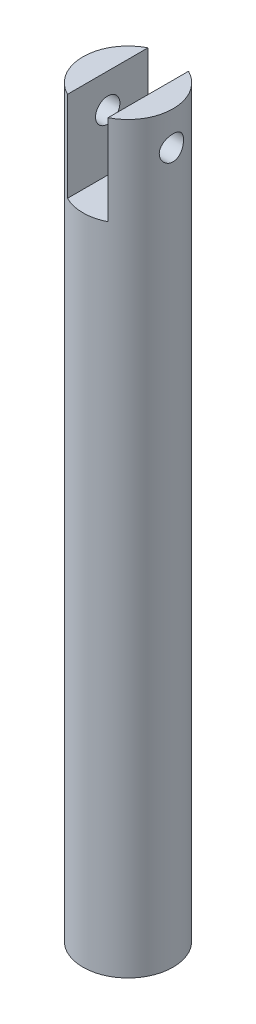
ISO-10303-21;
HEADER;
FILE_DESCRIPTION(('STEP AP214'),'2;1');
FILE_NAME('part.step','',(''),(''),'','','');
FILE_SCHEMA(('AUTOMOTIVE_DESIGN { 1 0 10303 214 1 1 1 1 }'));
ENDSEC;
DATA;
#1=APPLICATION_CONTEXT('core data for automotive mechanical design processes');
#2=APPLICATION_PROTOCOL_DEFINITION('international standard','automotive_design',2000,#1);
#3=PRODUCT_CONTEXT('',#1,'mechanical');
#4=PRODUCT('Part','Part','',(#3));
#5=PRODUCT_RELATED_PRODUCT_CATEGORY('part','',(#4));
#6=PRODUCT_DEFINITION_FORMATION('','',#4);
#7=PRODUCT_DEFINITION_CONTEXT('part definition',#1,'design');
#8=PRODUCT_DEFINITION('design','',#6,#7);
#9=PRODUCT_DEFINITION_SHAPE('','',#8);
#10=(LENGTH_UNIT() NAMED_UNIT(*) SI_UNIT(.MILLI.,.METRE.));
#11=(NAMED_UNIT(*) PLANE_ANGLE_UNIT() SI_UNIT($,.RADIAN.));
#12=(NAMED_UNIT(*) SI_UNIT($,.STERADIAN.) SOLID_ANGLE_UNIT());
#13=UNCERTAINTY_MEASURE_WITH_UNIT(LENGTH_MEASURE(1.E-05),#10,'distance_accuracy_value','');
#14=(GEOMETRIC_REPRESENTATION_CONTEXT(3) GLOBAL_UNCERTAINTY_ASSIGNED_CONTEXT((#13)) GLOBAL_UNIT_ASSIGNED_CONTEXT((#10,
#11,#12)) REPRESENTATION_CONTEXT('',''));
#15=CARTESIAN_POINT('',(0.,0.,0.));
#16=DIRECTION('',(0.,0.,1.));
#17=DIRECTION('',(1.,0.,0.));
#18=AXIS2_PLACEMENT_3D('',#15,#16,#17);
#19=CARTESIAN_POINT('',(0.,165.,0.));
#20=DIRECTION('',(0.,1.,0.));
#21=DIRECTION('',(0.,0.,1.));
#22=AXIS2_PLACEMENT_3D('',#19,#20,#21);
#23=PLANE('',#22);
#24=DIRECTION('',(0.,0.,-1.));
#25=VECTOR('',#24,1.);
#26=CARTESIAN_POINT('',(4.5,165.,0.));
#27=LINE('',#26,#25);
#28=CARTESIAN_POINT('',(4.5,165.,8.93028554974588));
#29=VERTEX_POINT('',#28);
#30=CARTESIAN_POINT('',(4.5,165.,-8.93028554974588));
#31=VERTEX_POINT('',#30);
#32=EDGE_CURVE('E58',#29,#31,#27,.T.);
#33=ORIENTED_EDGE('',*,*,#32,.F.);
#34=CARTESIAN_POINT('',(0.,165.,0.));
#35=DIRECTION('',(0.,1.,0.));
#36=DIRECTION('',(0.,0.,1.));
#37=AXIS2_PLACEMENT_3D('',#34,#35,#36);
#38=CIRCLE('',#37,10.);
#39=EDGE_CURVE('E102',#29,#31,#38,.T.);
#40=ORIENTED_EDGE('',*,*,#39,.T.);
#41=EDGE_LOOP('',(#33,#40));
#42=FACE_BOUND('',#41,.T.);
#43=ADVANCED_FACE('F33',(#42),#23,.T.);
#44=CARTESIAN_POINT('',(0.,165.,0.));
#45=DIRECTION('',(0.,-1.,0.));
#46=DIRECTION('',(0.,0.,-1.));
#47=AXIS2_PLACEMENT_3D('',#44,#45,#46);
#48=CYLINDRICAL_SURFACE('',#47,10.);
#49=CARTESIAN_POINT('',(-10.,154.8,0.));
#50=CARTESIAN_POINT('',(-9.99999782711062,154.800003386559,-0.148774661539189));
#51=CARTESIAN_POINT('',(-9.9966473286939,154.812337799472,-0.297585333539505));
#52=CARTESIAN_POINT('',(-9.9836070871437,154.861259427152,-0.590915377352122));
#53=CARTESIAN_POINT('',(-9.97391440506767,154.897857885885,-0.735432727183114));
#54=CARTESIAN_POINT('',(-9.94925888075004,154.99402760759,-1.0158999716253));
#55=CARTESIAN_POINT('',(-9.93430293083146,155.053568836318,-1.15186079795327));
#56=CARTESIAN_POINT('',(-9.90069893619965,155.193821453031,-1.41186713995326));
#57=CARTESIAN_POINT('',(-9.88205062098072,155.274534392213,-1.53591178164642));
#58=CARTESIAN_POINT('',(-9.84257839340819,155.456860153675,-1.77150674574477));
#59=CARTESIAN_POINT('',(-9.82171656406306,155.558881996826,-1.88273418059792));
#60=CARTESIAN_POINT('',(-9.78041033750172,155.78005544482,-2.08672685900315));
#61=CARTESIAN_POINT('',(-9.75996599578902,155.899209310591,-2.17948966190395));
#62=CARTESIAN_POINT('',(-9.72142045038815,156.153856412825,-2.34550594040794));
#63=CARTESIAN_POINT('',(-9.70336702035334,156.28960111161,-2.41838581893268));
#64=CARTESIAN_POINT('',(-9.67220575557493,156.571983500368,-2.54016030192197));
#65=CARTESIAN_POINT('',(-9.65909698346571,156.718619119419,-2.58905945297415));
#66=CARTESIAN_POINT('',(-9.6397010807165,157.015039944227,-2.66035893311824));
#67=CARTESIAN_POINT('',(-9.63326327331372,157.164674001672,-2.68334564996611));
#68=CARTESIAN_POINT('',(-9.6274882093643,157.465802406783,-2.70399621024263));
#69=CARTESIAN_POINT('',(-9.62814958985618,157.617296391786,-2.70166491443413));
#70=CARTESIAN_POINT('',(-9.63636343910677,157.913249730162,-2.67221068345233));
#71=CARTESIAN_POINT('',(-9.64371802942124,158.057786298388,-2.64579960378853));
#72=CARTESIAN_POINT('',(-9.66417246956971,158.340296488011,-2.57007659520705));
#73=CARTESIAN_POINT('',(-9.67727278885834,158.478269572117,-2.52076279500381));
#74=CARTESIAN_POINT('',(-9.70791505301908,158.745580817203,-2.40005953075999));
#75=CARTESIAN_POINT('',(-9.72550642491525,158.874801198981,-2.32842230940989));
#76=CARTESIAN_POINT('',(-9.76312239105775,159.119635831906,-2.16527848967669));
#77=CARTESIAN_POINT('',(-9.78314747476023,159.235247336868,-2.073767891536));
#78=CARTESIAN_POINT('',(-9.82419621962814,159.453646872194,-1.86984509586577));
#79=CARTESIAN_POINT('',(-9.84523086847348,159.555876080505,-1.7568357583884));
#80=CARTESIAN_POINT('',(-9.88532822784153,159.740047830832,-1.51501964000974));
#81=CARTESIAN_POINT('',(-9.90439085671031,159.821989533014,-1.38621220545104));
#82=CARTESIAN_POINT('',(-9.93851852041525,159.963514913375,-1.11557667636108));
#83=CARTESIAN_POINT('',(-9.95356499679829,160.022995305973,-0.973692076178258));
#84=CARTESIAN_POINT('',(-9.97783097942399,160.11709667255,-0.681437664338064));
#85=CARTESIAN_POINT('',(-9.98705179200694,160.151723219964,-0.531069763210365));
#86=CARTESIAN_POINT('',(-9.99842908447533,160.194251550347,-0.230884458265844));
#87=CARTESIAN_POINT('',(-10.000786274626,160.202912855267,-0.0811821027812173));
#88=CARTESIAN_POINT('',(-9.99874890418695,160.19536533025,0.21753690753403));
#89=CARTESIAN_POINT('',(-9.99435506036759,160.179159140544,0.366553633474505));
#90=CARTESIAN_POINT('',(-9.97943914885916,160.122958910074,0.656945682429493));
#91=CARTESIAN_POINT('',(-9.96902678125841,160.0833904254,0.798409517758602));
#92=CARTESIAN_POINT('',(-9.94325681392839,159.982084672722,1.07267627177578));
#93=CARTESIAN_POINT('',(-9.92789867156819,159.920344972094,1.20547823819418));
#94=CARTESIAN_POINT('',(-9.89347275386225,159.775053471939,1.46158793695578));
#95=CARTESIAN_POINT('',(-9.87433707216918,159.691091020193,1.5846533476921));
#96=CARTESIAN_POINT('',(-9.8345670726555,159.504251943255,1.81521391773308));
#97=CARTESIAN_POINT('',(-9.81393245162483,159.401371484791,1.92270591355773));
#98=CARTESIAN_POINT('',(-9.77274857958053,159.176069273472,2.12228305583065));
#99=CARTESIAN_POINT('',(-9.75221911203505,159.053167832728,2.2138317792438));
#100=CARTESIAN_POINT('',(-9.71422484892846,158.793310777353,2.37501987696983));
#101=CARTESIAN_POINT('',(-9.69675992824167,158.656355736893,2.44466014589861));
#102=CARTESIAN_POINT('',(-9.66707405627601,158.372946507826,2.55953142390198));
#103=CARTESIAN_POINT('',(-9.65482314679195,158.226552309027,2.60490227588316));
#104=CARTESIAN_POINT('',(-9.63695190227225,157.927823956503,2.67026743177152));
#105=CARTESIAN_POINT('',(-9.63132982056536,157.775491378452,2.69026842064778));
#106=CARTESIAN_POINT('',(-9.62750126828841,157.47470959402,2.70393453870695));
#107=CARTESIAN_POINT('',(-9.62905171428235,157.326302124101,2.69846291707097));
#108=CARTESIAN_POINT('',(-9.63882292855891,157.032610321882,2.663347108296));
#109=CARTESIAN_POINT('',(-9.64704351692299,156.88732590545,2.63370357316333));
#110=CARTESIAN_POINT('',(-9.66908223320172,156.605121496191,2.55159164235858));
#111=CARTESIAN_POINT('',(-9.68285437420306,156.468143170952,2.49931051009792));
#112=CARTESIAN_POINT('',(-9.7144445233644,156.204797630981,2.37355266173573));
#113=CARTESIAN_POINT('',(-9.7322631805526,156.078432122915,2.3000725449782));
#114=CARTESIAN_POINT('',(-9.77060877503339,155.83578947374,2.13140472742221));
#115=CARTESIAN_POINT('',(-9.79120110383606,155.719930655762,2.03563003127804));
#116=CARTESIAN_POINT('',(-9.83241350585107,155.505648810985,1.82620238877443));
#117=CARTESIAN_POINT('',(-9.85303358461553,155.407230053806,1.71254507727064));
#118=CARTESIAN_POINT('',(-9.89252319212526,155.228481134855,1.46754832216847));
#119=CARTESIAN_POINT('',(-9.9113439693372,155.148598743481,1.33587364656039));
#120=CARTESIAN_POINT('',(-9.94457675907837,155.012229021564,1.06045940918334));
#121=CARTESIAN_POINT('',(-9.95899152875418,154.955727052393,0.916727464560686));
#122=CARTESIAN_POINT('',(-9.97998045270278,154.87487709051,0.644659805995571));
#123=CARTESIAN_POINT('',(-9.98743240312409,154.846864379331,0.517468948295389));
#124=CARTESIAN_POINT('',(-9.99744287196379,154.809425321613,0.260194372540813));
#125=CARTESIAN_POINT('',(-10.0000019003015,154.799997038283,0.130110957365908));
#126=CARTESIAN_POINT('',(-10.,154.8,0.));
#127=B_SPLINE_CURVE_WITH_KNOTS('',3,(#49,#50,#51,#52,#53,#54,#55,#56,#57,#58,#59,#60,#61,#62,
#63,#64,#65,#66,#67,#68,#69,#70,#71,#72,#73,#74,#75,#76,#77,#78,#79,#80,#81,#82,#83,#84,#85,#86,
#87,#88,#89,#90,#91,#92,#93,#94,#95,#96,#97,#98,#99,#100,#101,#102,#103,#104,#105,#106,#107,
#108,#109,#110,#111,#112,#113,#114,#115,#116,#117,#118,#119,#120,#121,#122,#123,#124,#125,#126),
.UNSPECIFIED.,.T.,.F.,(4,2,2,2,2,2,2,2,2,2,2,2,2,2,2,2,2,2,2,2,2,2,2,2,2,2,2,2,2,2,2,2,2,2,2,2,
2,2,4),(0.,0.4458467616671,0.89190027339732,1.33737183210164,1.78287603849987,2.23788152875124,
2.69294712165628,3.15605180718671,3.61906865714873,4.07138297844436,4.52361046220639,
4.96288777079235,5.40220097720712,5.84657486439829,6.2910382702339,6.75038019248415,
7.20974112674612,7.67118937307156,8.13253410800253,8.58024533675495,9.02790903442276,
9.46765948757283,9.90745820485944,10.3560325750265,10.8046979382342,11.2663584986383,
11.7280002050195,12.1869524199219,12.6457836755925,13.089180858158,13.5325660810499,
13.9723515673493,14.4122076415362,14.8653077300239,15.3185185922744,15.7817442781461,
16.2446794950919,16.6346356533841,17.0245511699031),.UNSPECIFIED.);
#128=CARTESIAN_POINT('',(-10.,154.8,0.));
#129=VERTEX_POINT('',#128);
#130=EDGE_CURVE('E86',#129,#129,#127,.T.);
#131=ORIENTED_EDGE('',*,*,#130,.T.);
#132=EDGE_LOOP('',(#131));
#133=FACE_BOUND('',#132,.T.);
#134=CARTESIAN_POINT('',(9.62860322165162,157.5,-2.70000000000001));
#135=CARTESIAN_POINT('',(9.6286057280429,157.351336835201,-2.69999655900299));
#136=CARTESIAN_POINT('',(9.63208384696354,157.202637558112,-2.68767998648855));
#137=CARTESIAN_POINT('',(9.64557761207292,156.909538490372,-2.63883563352605));
#138=CARTESIAN_POINT('',(9.65559643086276,156.765140821798,-2.60229610347128));
#139=CARTESIAN_POINT('',(9.6809560194939,156.484927566899,-2.50629855598375));
#140=CARTESIAN_POINT('',(9.69628917493481,156.349100028633,-2.4468733158087));
#141=CARTESIAN_POINT('',(9.73054001291658,156.089319932487,-2.30689442210335));
#142=CARTESIAN_POINT('',(9.74945799945857,155.965368383058,-2.22633897646498));
#143=CARTESIAN_POINT('',(9.78929049159682,155.729680691704,-2.04417749563688));
#144=CARTESIAN_POINT('',(9.81024110105091,155.618294133831,-1.94212695493154));
#145=CARTESIAN_POINT('',(9.85146692605695,155.41399083801,-1.720827788983));
#146=CARTESIAN_POINT('',(9.87174206990631,155.321076055724,-1.60157734503675));
#147=CARTESIAN_POINT('',(9.90973607193501,155.154890362593,-1.34683342478799));
#148=CARTESIAN_POINT('',(9.92740737783171,155.081967841189,-1.21110496320858));
#149=CARTESIAN_POINT('',(9.95778787784737,154.960110180409,-0.928757102408092));
#150=CARTESIAN_POINT('',(9.97049793048538,154.911170890484,-0.782139592711362));
#151=CARTESIAN_POINT('',(9.98926854149535,154.839802725142,-0.485825353649318));
#152=CARTESIAN_POINT('',(9.99547806856363,154.816778982952,-0.336281502296952));
#153=CARTESIAN_POINT('',(10.0010691903509,154.796023018522,-0.0353335236431608));
#154=CARTESIAN_POINT('',(10.0004519555091,154.798286460829,0.116070280325717));
#155=CARTESIAN_POINT('',(9.9925678836156,154.827623566266,0.412296758741117));
#156=CARTESIAN_POINT('',(9.98547334585882,154.854054392749,0.557188384959518));
#157=CARTESIAN_POINT('',(9.96563570475151,154.929936371642,0.84039798252662));
#158=CARTESIAN_POINT('',(9.9528922753063,154.979388853036,0.978715573864246));
#159=CARTESIAN_POINT('',(9.92293481218154,155.100397485281,1.24648099930841));
#160=CARTESIAN_POINT('',(9.90567686412702,155.172172145261,1.3758249695454));
#161=CARTESIAN_POINT('',(9.86854715172272,155.335619553651,1.62085061906021));
#162=CARTESIAN_POINT('',(9.84867486715653,155.427296264659,1.73652957047251));
#163=CARTESIAN_POINT('',(9.80773009052841,155.631350650451,1.95477873759456));
#164=CARTESIAN_POINT('',(9.7866395077132,155.744288706712,2.05682224634866));
#165=CARTESIAN_POINT('',(9.74619743961254,155.98589184824,2.24065152284125));
#166=CARTESIAN_POINT('',(9.72684606600073,156.114557942145,2.32243599034944));
#167=CARTESIAN_POINT('',(9.6919994431629,156.385129829797,2.46384018569873));
#168=CARTESIAN_POINT('',(9.67652990962085,156.527115775674,2.52331333014262));
#169=CARTESIAN_POINT('',(9.65151627739817,156.819593761877,2.61737054010807));
#170=CARTESIAN_POINT('',(9.64197066671187,156.970083620981,2.65196095698713));
#171=CARTESIAN_POINT('',(9.63020874147968,157.270363270402,2.69435563413514));
#172=CARTESIAN_POINT('',(9.62777712765607,157.420033619409,2.70294701887154));
#173=CARTESIAN_POINT('',(9.62992885032024,157.718673033088,2.69527124881853));
#174=CARTESIAN_POINT('',(9.63451141883499,157.867642172743,2.67900681545819));
#175=CARTESIAN_POINT('',(9.64996687135091,158.157594459711,2.62277573652893));
#176=CARTESIAN_POINT('',(9.66071324235998,158.298677381942,2.58328540380536));
#177=CARTESIAN_POINT('',(9.68716114488267,158.572216330727,2.48226063960033));
#178=CARTESIAN_POINT('',(9.70286333541097,158.704671207112,2.42072327620295));
#179=CARTESIAN_POINT('',(9.73789319986385,158.960478616186,2.27576340488637));
#180=CARTESIAN_POINT('',(9.75729437915445,159.083559903449,2.19188041231183));
#181=CARTESIAN_POINT('',(9.79736473840698,159.314188352477,2.00517889062937));
#182=CARTESIAN_POINT('',(9.81803416243402,159.421732510785,1.90235670913284));
#183=CARTESIAN_POINT('',(9.85905567857819,159.62151790643,1.67704898471307));
#184=CARTESIAN_POINT('',(9.87938008232998,159.713209343837,1.55406986374836));
#185=CARTESIAN_POINT('',(9.91679230211157,159.874648660513,1.29401000390435));
#186=CARTESIAN_POINT('',(9.93388029044533,159.944397708106,1.156930016343));
#187=CARTESIAN_POINT('',(9.96278414626028,160.059326471535,0.873524562627499));
#188=CARTESIAN_POINT('',(9.97463943023666,160.104690458634,0.72727803866819));
#189=CARTESIAN_POINT('',(9.99191572025144,160.170091486393,0.428868767715208));
#190=CARTESIAN_POINT('',(9.99733819081505,160.190134291864,0.276707375478983));
#191=CARTESIAN_POINT('',(10.0010668069582,160.203955332069,-0.0240814786322249));
#192=CARTESIAN_POINT('',(9.99959121922956,160.19853910497,-0.172669738211618));
#193=CARTESIAN_POINT('',(9.99018510137762,160.163471464529,-0.466738310467977));
#194=CARTESIAN_POINT('',(9.98225482457425,160.133821002282,-0.612218744884311));
#195=CARTESIAN_POINT('',(9.96087560915395,160.051586578608,-0.894947223998435));
#196=CARTESIAN_POINT('',(9.94746691655142,159.999169692428,-1.03224710969827));
#197=CARTESIAN_POINT('',(9.91653117898034,159.873039286197,-1.29618147433337));
#198=CARTESIAN_POINT('',(9.89900354543022,159.799322722156,-1.4228144254864));
#199=CARTESIAN_POINT('',(9.86110732895719,159.630348350319,-1.66555568589808));
#200=CARTESIAN_POINT('',(9.84067443412776,159.534559105953,-1.78128398392585));
#201=CARTESIAN_POINT('',(9.79952523477207,159.325161482835,-1.99529608004692));
#202=CARTESIAN_POINT('',(9.77880885648649,159.21154838283,-2.0935752413979));
#203=CARTESIAN_POINT('',(9.73889546666951,158.966625366255,-2.27211177160667));
#204=CARTESIAN_POINT('',(9.71974362902075,158.834972228165,-2.35190931836916));
#205=CARTESIAN_POINT('',(9.68577259838324,158.559617534513,-2.48812579544668));
#206=CARTESIAN_POINT('',(9.67095064130863,158.415923741134,-2.54455965019283));
#207=CARTESIAN_POINT('',(9.64932074474974,158.14401855564,-2.6252729199288));
#208=CARTESIAN_POINT('',(9.64161548081269,158.016958256659,-2.65322876041464));
#209=CARTESIAN_POINT('',(9.63125592849245,157.759940939871,-2.69059268490396));
#210=CARTESIAN_POINT('',(9.62860103017769,157.629984273776,-2.70000300865046));
#211=CARTESIAN_POINT('',(9.62860322165162,157.5,-2.70000000000001));
#212=B_SPLINE_CURVE_WITH_KNOTS('',3,(#134,#135,#136,#137,#138,#139,#140,#141,#142,#143,#144,
#145,#146,#147,#148,#149,#150,#151,#152,#153,#154,#155,#156,#157,#158,#159,#160,#161,#162,#163,
#164,#165,#166,#167,#168,#169,#170,#171,#172,#173,#174,#175,#176,#177,#178,#179,#180,#181,#182,
#183,#184,#185,#186,#187,#188,#189,#190,#191,#192,#193,#194,#195,#196,#197,#198,#199,#200,#201,
#202,#203,#204,#205,#206,#207,#208,#209,#210,#211),.UNSPECIFIED.,.T.,.F.,(4,2,2,2,2,2,2,2,2,2,2,
2,2,2,2,2,2,2,2,2,2,2,2,2,2,2,2,2,2,2,2,2,2,2,2,2,2,2,4),(0.,0.445511384686915,
0.891239027749212,1.33633065289988,1.78146003964979,2.23690331739994,2.69239478868559,
3.15538119713909,3.61828745265076,4.07033646532584,4.52230797599975,4.96259638653628,
5.40291021699995,5.84767761642819,6.2925336525938,6.75138082306013,7.21025743482634,
7.67209811645267,8.13382087060837,8.58141758197617,9.02896529011132,9.46763992251741,
9.90637291356798,10.3549595477224,10.8036327817508,11.2656407018903,11.7276240182065,
12.1860653429292,12.644402276656,13.0883365786915,13.5322534589779,13.9729662142242,
14.4137419840425,14.8665081924962,15.3193945345948,15.7825631115304,16.2454353640164,
16.6350172007772,17.0245519848356),.UNSPECIFIED.);
#213=CARTESIAN_POINT('',(9.62860322165162,157.5,-2.70000000000001));
#214=VERTEX_POINT('',#213);
#215=EDGE_CURVE('E117',#214,#214,#212,.T.);
#216=ORIENTED_EDGE('',*,*,#215,.T.);
#217=EDGE_LOOP('',(#216));
#218=FACE_BOUND('',#217,.T.);
#219=CARTESIAN_POINT('',(0.,145.,0.));
#220=DIRECTION('',(0.,-1.,0.));
#221=DIRECTION('',(0.,0.,-1.));
#222=AXIS2_PLACEMENT_3D('',#219,#220,#221);
#223=CIRCLE('',#222,10.);
#224=CARTESIAN_POINT('',(-4.5,145.,-8.93028554974588));
#225=VERTEX_POINT('',#224);
#226=CARTESIAN_POINT('',(4.5,145.,-8.93028554974588));
#227=VERTEX_POINT('',#226);
#228=EDGE_CURVE('E11',#225,#227,#223,.T.);
#229=ORIENTED_EDGE('',*,*,#228,.T.);
#230=DIRECTION('',(0.,-1.,0.));
#231=VECTOR('',#230,1.);
#232=CARTESIAN_POINT('',(4.5,165.,-8.93028554974588));
#233=LINE('',#232,#231);
#234=EDGE_CURVE('E92',#227,#31,#233,.F.);
#235=ORIENTED_EDGE('',*,*,#234,.T.);
#236=ORIENTED_EDGE('',*,*,#39,.F.);
#237=DIRECTION('',(0.,-1.,0.));
#238=VECTOR('',#237,1.);
#239=CARTESIAN_POINT('',(4.5,165.,8.93028554974588));
#240=LINE('',#239,#238);
#241=CARTESIAN_POINT('',(4.5,145.,8.93028554974588));
#242=VERTEX_POINT('',#241);
#243=EDGE_CURVE('E94',#29,#242,#240,.T.);
#244=ORIENTED_EDGE('',*,*,#243,.T.);
#245=CARTESIAN_POINT('',(-4.5,145.,8.93028554974588));
#246=VERTEX_POINT('',#245);
#247=EDGE_CURVE('E43',#242,#246,#223,.T.);
#248=ORIENTED_EDGE('',*,*,#247,.T.);
#249=DIRECTION('',(0.,-1.,0.));
#250=VECTOR('',#249,1.);
#251=CARTESIAN_POINT('',(-4.5,165.,8.93028554974588));
#252=LINE('',#251,#250);
#253=CARTESIAN_POINT('',(-4.5,165.,8.93028554974588));
#254=VERTEX_POINT('',#253);
#255=EDGE_CURVE('E85',#246,#254,#252,.F.);
#256=ORIENTED_EDGE('',*,*,#255,.T.);
#257=CARTESIAN_POINT('',(-4.5,165.,-8.93028554974588));
#258=VERTEX_POINT('',#257);
#259=EDGE_CURVE('E91',#258,#254,#38,.T.);
#260=ORIENTED_EDGE('',*,*,#259,.F.);
#261=DIRECTION('',(0.,-1.,0.));
#262=VECTOR('',#261,1.);
#263=CARTESIAN_POINT('',(-4.5,165.,-8.93028554974588));
#264=LINE('',#263,#262);
#265=EDGE_CURVE('E50',#258,#225,#264,.T.);
#266=ORIENTED_EDGE('',*,*,#265,.T.);
#267=EDGE_LOOP('',(#229,#235,#236,#244,#248,#256,#260,#266));
#268=FACE_BOUND('',#267,.T.);
#269=CARTESIAN_POINT('',(0.,0.,0.));
#270=DIRECTION('',(0.,1.,0.));
#271=DIRECTION('',(0.,0.,1.));
#272=AXIS2_PLACEMENT_3D('',#269,#270,#271);
#273=CIRCLE('',#272,10.);
#274=CARTESIAN_POINT('',(0.,0.,10.));
#275=VERTEX_POINT('',#274);
#276=EDGE_CURVE('E100',#275,#275,#273,.T.);
#277=ORIENTED_EDGE('',*,*,#276,.T.);
#278=EDGE_LOOP('',(#277));
#279=FACE_BOUND('',#278,.T.);
#280=ADVANCED_FACE('F35',(#133,#218,#268,#279),#48,.T.);
#281=DIRECTION('',(0.,0.,1.));
#282=VECTOR('',#281,1.);
#283=CARTESIAN_POINT('',(-4.5,165.,0.));
#284=LINE('',#283,#282);
#285=EDGE_CURVE('E105',#258,#254,#284,.T.);
#286=ORIENTED_EDGE('',*,*,#285,.F.);
#287=ORIENTED_EDGE('',*,*,#259,.T.);
#288=EDGE_LOOP('',(#286,#287));
#289=FACE_BOUND('',#288,.T.);
#290=ADVANCED_FACE('F138',(#289),#23,.T.);
#291=CARTESIAN_POINT('',(0.,0.,0.));
#292=DIRECTION('',(0.,1.,0.));
#293=DIRECTION('',(0.,0.,1.));
#294=AXIS2_PLACEMENT_3D('',#291,#292,#293);
#295=PLANE('',#294);
#296=ORIENTED_EDGE('',*,*,#276,.F.);
#297=EDGE_LOOP('',(#296));
#298=FACE_BOUND('',#297,.T.);
#299=ADVANCED_FACE('F131',(#298),#295,.F.);
#300=CARTESIAN_POINT('',(-4.5,145.,-10.));
#301=DIRECTION('',(0.,-1.,0.));
#302=DIRECTION('',(0.,0.,-1.));
#303=AXIS2_PLACEMENT_3D('',#300,#301,#302);
#304=PLANE('',#303);
#305=DIRECTION('',(0.,0.,1.));
#306=VECTOR('',#305,1.);
#307=CARTESIAN_POINT('',(4.5,145.,-10.));
#308=LINE('',#307,#306);
#309=EDGE_CURVE('E81',#227,#242,#308,.T.);
#310=ORIENTED_EDGE('',*,*,#309,.F.);
#311=ORIENTED_EDGE('',*,*,#228,.F.);
#312=DIRECTION('',(0.,0.,1.));
#313=VECTOR('',#312,1.);
#314=CARTESIAN_POINT('',(-4.5,145.,-10.));
#315=LINE('',#314,#313);
#316=EDGE_CURVE('E78',#225,#246,#315,.T.);
#317=ORIENTED_EDGE('',*,*,#316,.T.);
#318=ORIENTED_EDGE('',*,*,#247,.F.);
#319=EDGE_LOOP('',(#310,#311,#317,#318));
#320=FACE_BOUND('',#319,.T.);
#321=ADVANCED_FACE('F77',(#320),#304,.F.);
#322=CARTESIAN_POINT('',(4.5,185.,-10.));
#323=DIRECTION('',(1.,0.,0.));
#324=DIRECTION('',(0.,0.,-1.));
#325=AXIS2_PLACEMENT_3D('',#322,#323,#324);
#326=PLANE('',#325);
#327=CARTESIAN_POINT('',(4.5,157.5,0.));
#328=DIRECTION('',(1.,0.,0.));
#329=DIRECTION('',(0.,0.,-1.));
#330=AXIS2_PLACEMENT_3D('',#327,#328,#329);
#331=CIRCLE('',#330,2.70000000000001);
#332=CARTESIAN_POINT('',(4.5,157.5,-2.70000000000001));
#333=VERTEX_POINT('',#332);
#334=EDGE_CURVE('E160',#333,#333,#331,.T.);
#335=ORIENTED_EDGE('',*,*,#334,.T.);
#336=EDGE_LOOP('',(#335));
#337=FACE_BOUND('',#336,.T.);
#338=ORIENTED_EDGE('',*,*,#32,.T.);
#339=ORIENTED_EDGE('',*,*,#234,.F.);
#340=ORIENTED_EDGE('',*,*,#309,.T.);
#341=ORIENTED_EDGE('',*,*,#243,.F.);
#342=EDGE_LOOP('',(#338,#339,#340,#341));
#343=FACE_BOUND('',#342,.T.);
#344=ADVANCED_FACE('F108',(#337,#343),#326,.F.);
#345=CARTESIAN_POINT('',(-4.5,185.,-10.));
#346=DIRECTION('',(-1.,0.,0.));
#347=DIRECTION('',(0.,0.,1.));
#348=AXIS2_PLACEMENT_3D('',#345,#346,#347);
#349=PLANE('',#348);
#350=CARTESIAN_POINT('',(-4.5,157.5,0.));
#351=DIRECTION('',(-1.,0.,0.));
#352=DIRECTION('',(0.,0.,1.));
#353=AXIS2_PLACEMENT_3D('',#350,#351,#352);
#354=CIRCLE('',#353,2.70000000000001);
#355=CARTESIAN_POINT('',(-4.5,157.5,2.70000000000001));
#356=VERTEX_POINT('',#355);
#357=EDGE_CURVE('E38',#356,#356,#354,.T.);
#358=ORIENTED_EDGE('',*,*,#357,.T.);
#359=EDGE_LOOP('',(#358));
#360=FACE_BOUND('',#359,.T.);
#361=ORIENTED_EDGE('',*,*,#285,.T.);
#362=ORIENTED_EDGE('',*,*,#255,.F.);
#363=ORIENTED_EDGE('',*,*,#316,.F.);
#364=ORIENTED_EDGE('',*,*,#265,.F.);
#365=EDGE_LOOP('',(#361,#362,#363,#364));
#366=FACE_BOUND('',#365,.T.);
#367=ADVANCED_FACE('F83',(#360,#366),#349,.F.);
#368=CARTESIAN_POINT('',(-10.,157.5,0.));
#369=DIRECTION('',(1.,0.,0.));
#370=DIRECTION('',(0.,0.,-1.));
#371=AXIS2_PLACEMENT_3D('',#368,#369,#370);
#372=CYLINDRICAL_SURFACE('',#371,2.70000000000001);
#373=ORIENTED_EDGE('',*,*,#357,.F.);
#374=EDGE_LOOP('',(#373));
#375=FACE_BOUND('',#374,.T.);
#376=ORIENTED_EDGE('',*,*,#130,.F.);
#377=EDGE_LOOP('',(#376));
#378=FACE_BOUND('',#377,.T.);
#379=ADVANCED_FACE('F122',(#375,#378),#372,.F.);
#380=ORIENTED_EDGE('',*,*,#334,.F.);
#381=EDGE_LOOP('',(#380));
#382=FACE_BOUND('',#381,.T.);
#383=ORIENTED_EDGE('',*,*,#215,.F.);
#384=EDGE_LOOP('',(#383));
#385=FACE_BOUND('',#384,.T.);
#386=ADVANCED_FACE('F126',(#382,#385),#372,.F.);
#387=CLOSED_SHELL('',(#43,#280,#290,#299,#321,#344,#367,#379,#386));
#388=MANIFOLD_SOLID_BREP('B2',#387);
#389=ADVANCED_BREP_SHAPE_REPRESENTATION('',(#18,#388),#14);
#390=SHAPE_DEFINITION_REPRESENTATION(#9,#389);
ENDSEC;
END-ISO-10303-21;
